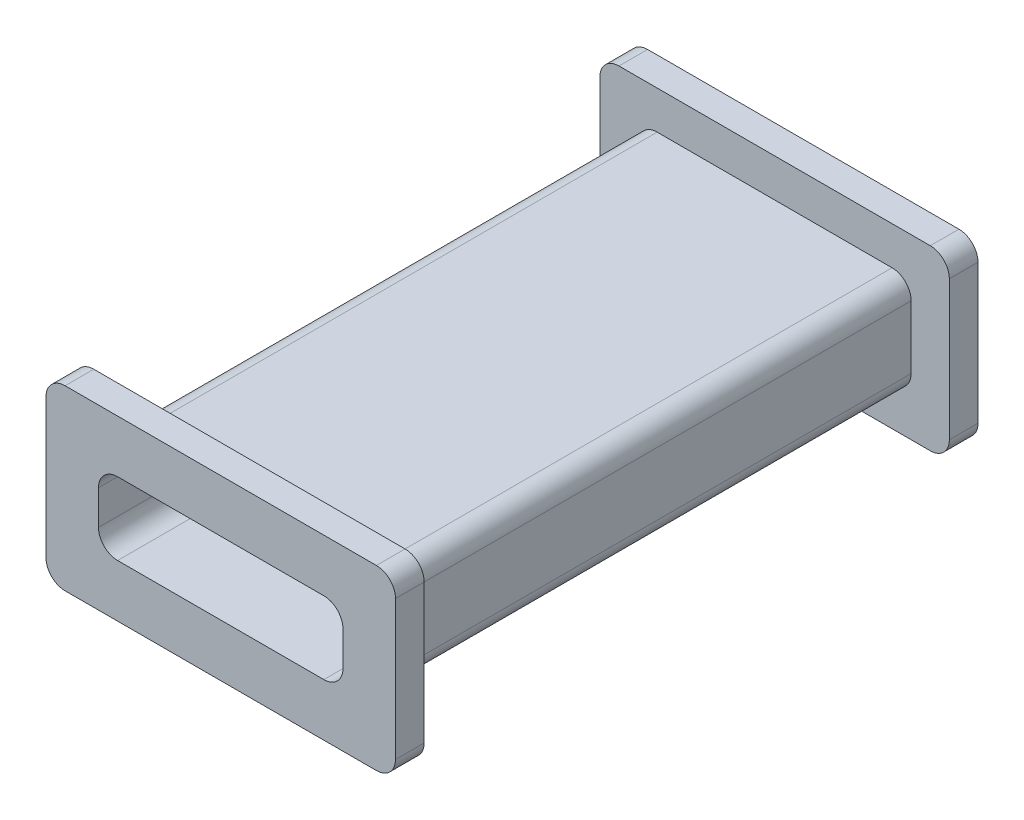
ISO-10303-21;
HEADER;
FILE_DESCRIPTION(('STEP AP214'),'2;1');
FILE_NAME('part.step','',(''),(''),'','','');
FILE_SCHEMA(('AUTOMOTIVE_DESIGN { 1 0 10303 214 1 1 1 1 }'));
ENDSEC;
DATA;
#1=APPLICATION_CONTEXT('core data for automotive mechanical design processes');
#2=APPLICATION_PROTOCOL_DEFINITION('international standard','automotive_design',2000,#1);
#3=PRODUCT_CONTEXT('',#1,'mechanical');
#4=PRODUCT('Part','Part','',(#3));
#5=PRODUCT_RELATED_PRODUCT_CATEGORY('part','',(#4));
#6=PRODUCT_DEFINITION_FORMATION('','',#4);
#7=PRODUCT_DEFINITION_CONTEXT('part definition',#1,'design');
#8=PRODUCT_DEFINITION('design','',#6,#7);
#9=PRODUCT_DEFINITION_SHAPE('','',#8);
#10=(LENGTH_UNIT() NAMED_UNIT(*) SI_UNIT(.MILLI.,.METRE.));
#11=(NAMED_UNIT(*) PLANE_ANGLE_UNIT() SI_UNIT($,.RADIAN.));
#12=(NAMED_UNIT(*) SI_UNIT($,.STERADIAN.) SOLID_ANGLE_UNIT());
#13=UNCERTAINTY_MEASURE_WITH_UNIT(LENGTH_MEASURE(1.E-05),#10,'distance_accuracy_value','');
#14=(GEOMETRIC_REPRESENTATION_CONTEXT(3) GLOBAL_UNCERTAINTY_ASSIGNED_CONTEXT((#13)) GLOBAL_UNIT_ASSIGNED_CONTEXT((#10,
#11,#12)) REPRESENTATION_CONTEXT('',''));
#15=CARTESIAN_POINT('',(0.,0.,0.));
#16=DIRECTION('',(0.,0.,1.));
#17=DIRECTION('',(1.,0.,0.));
#18=AXIS2_PLACEMENT_3D('',#15,#16,#17);
#19=CARTESIAN_POINT('',(14.3,-5.3,55.));
#20=DIRECTION('',(-1.,0.,0.));
#21=DIRECTION('',(0.,0.,1.));
#22=AXIS2_PLACEMENT_3D('',#19,#20,#21);
#23=PLANE('',#22);
#24=DIRECTION('',(0.,1.,0.));
#25=VECTOR('',#24,1.);
#26=CARTESIAN_POINT('',(14.3,-5.3,55.));
#27=LINE('',#26,#25);
#28=CARTESIAN_POINT('',(14.3,-3.3,55.));
#29=VERTEX_POINT('',#28);
#30=CARTESIAN_POINT('',(14.3,3.3,55.));
#31=VERTEX_POINT('',#30);
#32=EDGE_CURVE('E431',#29,#31,#27,.T.);
#33=ORIENTED_EDGE('',*,*,#32,.F.);
#34=DIRECTION('',(0.,0.,-1.));
#35=VECTOR('',#34,1.);
#36=CARTESIAN_POINT('',(14.3,-3.3,55.));
#37=LINE('',#36,#35);
#38=CARTESIAN_POINT('',(14.3,-3.3,0.));
#39=VERTEX_POINT('',#38);
#40=EDGE_CURVE('E254',#29,#39,#37,.T.);
#41=ORIENTED_EDGE('',*,*,#40,.T.);
#42=DIRECTION('',(0.,1.,0.));
#43=VECTOR('',#42,1.);
#44=CARTESIAN_POINT('',(14.3,-5.3,0.));
#45=LINE('',#44,#43);
#46=CARTESIAN_POINT('',(14.3,3.3,0.));
#47=VERTEX_POINT('',#46);
#48=EDGE_CURVE('E259',#39,#47,#45,.T.);
#49=ORIENTED_EDGE('',*,*,#48,.T.);
#50=DIRECTION('',(0.,0.,-1.));
#51=VECTOR('',#50,1.);
#52=CARTESIAN_POINT('',(14.3,3.3,55.));
#53=LINE('',#52,#51);
#54=EDGE_CURVE('E243',#47,#31,#53,.F.);
#55=ORIENTED_EDGE('',*,*,#54,.T.);
#56=EDGE_LOOP('',(#33,#41,#49,#55));
#57=FACE_BOUND('',#56,.T.);
#58=ADVANCED_FACE('F34',(#57),#23,.F.);
#59=CARTESIAN_POINT('',(-14.3,5.3,55.));
#60=DIRECTION('',(0.,-1.,0.));
#61=DIRECTION('',(0.,0.,-1.));
#62=AXIS2_PLACEMENT_3D('',#59,#60,#61);
#63=PLANE('',#62);
#64=DIRECTION('',(-1.,0.,0.));
#65=VECTOR('',#64,1.);
#66=CARTESIAN_POINT('',(-14.3,5.3,0.));
#67=LINE('',#66,#65);
#68=CARTESIAN_POINT('',(12.3,5.3,0.));
#69=VERTEX_POINT('',#68);
#70=CARTESIAN_POINT('',(-12.3,5.3,0.));
#71=VERTEX_POINT('',#70);
#72=EDGE_CURVE('E263',#69,#71,#67,.T.);
#73=ORIENTED_EDGE('',*,*,#72,.T.);
#74=DIRECTION('',(0.,0.,-1.));
#75=VECTOR('',#74,1.);
#76=CARTESIAN_POINT('',(-12.3,5.3,55.));
#77=LINE('',#76,#75);
#78=CARTESIAN_POINT('',(-12.3,5.3,55.));
#79=VERTEX_POINT('',#78);
#80=EDGE_CURVE('E255',#71,#79,#77,.F.);
#81=ORIENTED_EDGE('',*,*,#80,.T.);
#82=DIRECTION('',(-1.,0.,0.));
#83=VECTOR('',#82,1.);
#84=CARTESIAN_POINT('',(-14.3,5.3,55.));
#85=LINE('',#84,#83);
#86=CARTESIAN_POINT('',(12.3,5.3,55.));
#87=VERTEX_POINT('',#86);
#88=EDGE_CURVE('E433',#87,#79,#85,.T.);
#89=ORIENTED_EDGE('',*,*,#88,.F.);
#90=DIRECTION('',(0.,0.,-1.));
#91=VECTOR('',#90,1.);
#92=CARTESIAN_POINT('',(12.3,5.3,55.));
#93=LINE('',#92,#91);
#94=EDGE_CURVE('E290',#87,#69,#93,.T.);
#95=ORIENTED_EDGE('',*,*,#94,.T.);
#96=EDGE_LOOP('',(#73,#81,#89,#95));
#97=FACE_BOUND('',#96,.T.);
#98=ADVANCED_FACE('F507',(#97),#63,.F.);
#99=CARTESIAN_POINT('',(-14.3,-5.3,55.));
#100=DIRECTION('',(1.,0.,0.));
#101=DIRECTION('',(0.,0.,-1.));
#102=AXIS2_PLACEMENT_3D('',#99,#100,#101);
#103=PLANE('',#102);
#104=DIRECTION('',(0.,-1.,0.));
#105=VECTOR('',#104,1.);
#106=CARTESIAN_POINT('',(-14.3,-5.3,0.));
#107=LINE('',#106,#105);
#108=CARTESIAN_POINT('',(-14.3,3.3,0.));
#109=VERTEX_POINT('',#108);
#110=CARTESIAN_POINT('',(-14.3,-3.3,0.));
#111=VERTEX_POINT('',#110);
#112=EDGE_CURVE('E445',#109,#111,#107,.T.);
#113=ORIENTED_EDGE('',*,*,#112,.T.);
#114=DIRECTION('',(0.,0.,-1.));
#115=VECTOR('',#114,1.);
#116=CARTESIAN_POINT('',(-14.3,-3.3,55.));
#117=LINE('',#116,#115);
#118=CARTESIAN_POINT('',(-14.3,-3.3,55.));
#119=VERTEX_POINT('',#118);
#120=EDGE_CURVE('E288',#111,#119,#117,.F.);
#121=ORIENTED_EDGE('',*,*,#120,.T.);
#122=DIRECTION('',(0.,-1.,0.));
#123=VECTOR('',#122,1.);
#124=CARTESIAN_POINT('',(-14.3,-5.3,55.));
#125=LINE('',#124,#123);
#126=CARTESIAN_POINT('',(-14.3,3.3,55.));
#127=VERTEX_POINT('',#126);
#128=EDGE_CURVE('E437',#127,#119,#125,.T.);
#129=ORIENTED_EDGE('',*,*,#128,.F.);
#130=DIRECTION('',(0.,0.,-1.));
#131=VECTOR('',#130,1.);
#132=CARTESIAN_POINT('',(-14.3,3.3,55.));
#133=LINE('',#132,#131);
#134=EDGE_CURVE('E285',#127,#109,#133,.T.);
#135=ORIENTED_EDGE('',*,*,#134,.T.);
#136=EDGE_LOOP('',(#113,#121,#129,#135));
#137=FACE_BOUND('',#136,.T.);
#138=ADVANCED_FACE('F499',(#137),#103,.F.);
#139=CARTESIAN_POINT('',(-14.3,-5.3,55.));
#140=DIRECTION('',(0.,1.,0.));
#141=DIRECTION('',(0.,0.,1.));
#142=AXIS2_PLACEMENT_3D('',#139,#140,#141);
#143=PLANE('',#142);
#144=DIRECTION('',(1.,0.,0.));
#145=VECTOR('',#144,1.);
#146=CARTESIAN_POINT('',(-14.3,-5.3,55.));
#147=LINE('',#146,#145);
#148=CARTESIAN_POINT('',(-12.3,-5.3,55.));
#149=VERTEX_POINT('',#148);
#150=CARTESIAN_POINT('',(12.3,-5.3,55.));
#151=VERTEX_POINT('',#150);
#152=EDGE_CURVE('E440',#149,#151,#147,.T.);
#153=ORIENTED_EDGE('',*,*,#152,.F.);
#154=DIRECTION('',(0.,0.,-1.));
#155=VECTOR('',#154,1.);
#156=CARTESIAN_POINT('',(-12.3,-5.3,55.));
#157=LINE('',#156,#155);
#158=CARTESIAN_POINT('',(-12.3,-5.3,0.));
#159=VERTEX_POINT('',#158);
#160=EDGE_CURVE('E272',#149,#159,#157,.T.);
#161=ORIENTED_EDGE('',*,*,#160,.T.);
#162=DIRECTION('',(1.,0.,0.));
#163=VECTOR('',#162,1.);
#164=CARTESIAN_POINT('',(-14.3,-5.3,0.));
#165=LINE('',#164,#163);
#166=CARTESIAN_POINT('',(12.3,-5.3,0.));
#167=VERTEX_POINT('',#166);
#168=EDGE_CURVE('E434',#159,#167,#165,.T.);
#169=ORIENTED_EDGE('',*,*,#168,.T.);
#170=DIRECTION('',(0.,0.,-1.));
#171=VECTOR('',#170,1.);
#172=CARTESIAN_POINT('',(12.3,-5.3,55.));
#173=LINE('',#172,#171);
#174=EDGE_CURVE('E277',#167,#151,#173,.F.);
#175=ORIENTED_EDGE('',*,*,#174,.T.);
#176=EDGE_LOOP('',(#153,#161,#169,#175));
#177=FACE_BOUND('',#176,.T.);
#178=ADVANCED_FACE('F485',(#177),#143,.F.);
#179=CARTESIAN_POINT('',(12.8,-3.8,55.));
#180=DIRECTION('',(-1.,0.,0.));
#181=DIRECTION('',(0.,0.,1.));
#182=AXIS2_PLACEMENT_3D('',#179,#180,#181);
#183=PLANE('',#182);
#184=DIRECTION('',(0.,1.,0.));
#185=VECTOR('',#184,1.);
#186=CARTESIAN_POINT('',(12.8,-3.8,-3.));
#187=LINE('',#186,#185);
#188=CARTESIAN_POINT('',(12.8,-1.8,-3.));
#189=VERTEX_POINT('',#188);
#190=CARTESIAN_POINT('',(12.8,1.8,-3.));
#191=VERTEX_POINT('',#190);
#192=EDGE_CURVE('E374',#189,#191,#187,.T.);
#193=ORIENTED_EDGE('',*,*,#192,.F.);
#194=DIRECTION('',(0.,0.,-1.));
#195=VECTOR('',#194,1.);
#196=CARTESIAN_POINT('',(12.8,-1.8,58.));
#197=LINE('',#196,#195);
#198=CARTESIAN_POINT('',(12.8,-1.8,58.));
#199=VERTEX_POINT('',#198);
#200=EDGE_CURVE('E345',#189,#199,#197,.F.);
#201=ORIENTED_EDGE('',*,*,#200,.T.);
#202=DIRECTION('',(0.,1.,0.));
#203=VECTOR('',#202,1.);
#204=CARTESIAN_POINT('',(12.8,-3.8,58.));
#205=LINE('',#204,#203);
#206=CARTESIAN_POINT('',(12.8,1.8,58.));
#207=VERTEX_POINT('',#206);
#208=EDGE_CURVE('E386',#199,#207,#205,.T.);
#209=ORIENTED_EDGE('',*,*,#208,.T.);
#210=DIRECTION('',(0.,0.,-1.));
#211=VECTOR('',#210,1.);
#212=CARTESIAN_POINT('',(12.8,1.8,-3.));
#213=LINE('',#212,#211);
#214=EDGE_CURVE('E342',#207,#191,#213,.T.);
#215=ORIENTED_EDGE('',*,*,#214,.T.);
#216=EDGE_LOOP('',(#193,#201,#209,#215));
#217=FACE_BOUND('',#216,.T.);
#218=ADVANCED_FACE('F390',(#217),#183,.T.);
#219=CARTESIAN_POINT('',(-12.8,3.8,55.));
#220=DIRECTION('',(0.,-1.,0.));
#221=DIRECTION('',(0.,0.,-1.));
#222=AXIS2_PLACEMENT_3D('',#219,#220,#221);
#223=PLANE('',#222);
#224=DIRECTION('',(-1.,0.,0.));
#225=VECTOR('',#224,1.);
#226=CARTESIAN_POINT('',(-12.8,3.8,58.));
#227=LINE('',#226,#225);
#228=CARTESIAN_POINT('',(10.8,3.8,58.));
#229=VERTEX_POINT('',#228);
#230=CARTESIAN_POINT('',(-10.8,3.8,58.));
#231=VERTEX_POINT('',#230);
#232=EDGE_CURVE('E388',#229,#231,#227,.T.);
#233=ORIENTED_EDGE('',*,*,#232,.T.);
#234=DIRECTION('',(0.,0.,-1.));
#235=VECTOR('',#234,1.);
#236=CARTESIAN_POINT('',(-10.8,3.8,-3.));
#237=LINE('',#236,#235);
#238=CARTESIAN_POINT('',(-10.8,3.8,-3.));
#239=VERTEX_POINT('',#238);
#240=EDGE_CURVE('E353',#231,#239,#237,.T.);
#241=ORIENTED_EDGE('',*,*,#240,.T.);
#242=DIRECTION('',(-1.,0.,0.));
#243=VECTOR('',#242,1.);
#244=CARTESIAN_POINT('',(-12.8,3.8,-3.));
#245=LINE('',#244,#243);
#246=CARTESIAN_POINT('',(10.8,3.8,-3.));
#247=VERTEX_POINT('',#246);
#248=EDGE_CURVE('E372',#247,#239,#245,.T.);
#249=ORIENTED_EDGE('',*,*,#248,.F.);
#250=DIRECTION('',(0.,0.,-1.));
#251=VECTOR('',#250,1.);
#252=CARTESIAN_POINT('',(10.8,3.8,58.));
#253=LINE('',#252,#251);
#254=EDGE_CURVE('E56',#247,#229,#253,.F.);
#255=ORIENTED_EDGE('',*,*,#254,.T.);
#256=EDGE_LOOP('',(#233,#241,#249,#255));
#257=FACE_BOUND('',#256,.T.);
#258=ADVANCED_FACE('F377',(#257),#223,.T.);
#259=CARTESIAN_POINT('',(-12.8,-3.8,55.));
#260=DIRECTION('',(1.,0.,0.));
#261=DIRECTION('',(0.,0.,-1.));
#262=AXIS2_PLACEMENT_3D('',#259,#260,#261);
#263=PLANE('',#262);
#264=DIRECTION('',(0.,-1.,0.));
#265=VECTOR('',#264,1.);
#266=CARTESIAN_POINT('',(-12.8,-3.8,58.));
#267=LINE('',#266,#265);
#268=CARTESIAN_POINT('',(-12.8,1.8,58.));
#269=VERTEX_POINT('',#268);
#270=CARTESIAN_POINT('',(-12.8,-1.8,58.));
#271=VERTEX_POINT('',#270);
#272=EDGE_CURVE('E394',#269,#271,#267,.T.);
#273=ORIENTED_EDGE('',*,*,#272,.T.);
#274=DIRECTION('',(0.,0.,-1.));
#275=VECTOR('',#274,1.);
#276=CARTESIAN_POINT('',(-12.8,-1.8,-3.));
#277=LINE('',#276,#275);
#278=CARTESIAN_POINT('',(-12.8,-1.8,-3.));
#279=VERTEX_POINT('',#278);
#280=EDGE_CURVE('E349',#271,#279,#277,.T.);
#281=ORIENTED_EDGE('',*,*,#280,.T.);
#282=DIRECTION('',(0.,-1.,0.));
#283=VECTOR('',#282,1.);
#284=CARTESIAN_POINT('',(-12.8,-3.8,-3.));
#285=LINE('',#284,#283);
#286=CARTESIAN_POINT('',(-12.8,1.8,-3.));
#287=VERTEX_POINT('',#286);
#288=EDGE_CURVE('E380',#287,#279,#285,.T.);
#289=ORIENTED_EDGE('',*,*,#288,.F.);
#290=DIRECTION('',(0.,0.,-1.));
#291=VECTOR('',#290,1.);
#292=CARTESIAN_POINT('',(-12.8,1.8,58.));
#293=LINE('',#292,#291);
#294=EDGE_CURVE('E347',#287,#269,#293,.F.);
#295=ORIENTED_EDGE('',*,*,#294,.T.);
#296=EDGE_LOOP('',(#273,#281,#289,#295));
#297=FACE_BOUND('',#296,.T.);
#298=ADVANCED_FACE('F576',(#297),#263,.T.);
#299=CARTESIAN_POINT('',(-12.8,-3.8,55.));
#300=DIRECTION('',(0.,1.,0.));
#301=DIRECTION('',(0.,0.,1.));
#302=AXIS2_PLACEMENT_3D('',#299,#300,#301);
#303=PLANE('',#302);
#304=DIRECTION('',(1.,0.,0.));
#305=VECTOR('',#304,1.);
#306=CARTESIAN_POINT('',(-12.8,-3.8,58.));
#307=LINE('',#306,#305);
#308=CARTESIAN_POINT('',(-10.8,-3.8,58.));
#309=VERTEX_POINT('',#308);
#310=CARTESIAN_POINT('',(10.8,-3.8,58.));
#311=VERTEX_POINT('',#310);
#312=EDGE_CURVE('E405',#309,#311,#307,.T.);
#313=ORIENTED_EDGE('',*,*,#312,.T.);
#314=DIRECTION('',(0.,0.,-1.));
#315=VECTOR('',#314,1.);
#316=CARTESIAN_POINT('',(10.8,-3.8,-3.));
#317=LINE('',#316,#315);
#318=CARTESIAN_POINT('',(10.8,-3.8,-3.));
#319=VERTEX_POINT('',#318);
#320=EDGE_CURVE('E339',#311,#319,#317,.T.);
#321=ORIENTED_EDGE('',*,*,#320,.T.);
#322=DIRECTION('',(1.,0.,0.));
#323=VECTOR('',#322,1.);
#324=CARTESIAN_POINT('',(-12.8,-3.8,-3.));
#325=LINE('',#324,#323);
#326=CARTESIAN_POINT('',(-10.8,-3.8,-3.));
#327=VERTEX_POINT('',#326);
#328=EDGE_CURVE('E578',#327,#319,#325,.T.);
#329=ORIENTED_EDGE('',*,*,#328,.F.);
#330=DIRECTION('',(0.,0.,-1.));
#331=VECTOR('',#330,1.);
#332=CARTESIAN_POINT('',(-10.8,-3.8,58.));
#333=LINE('',#332,#331);
#334=EDGE_CURVE('E337',#327,#309,#333,.F.);
#335=ORIENTED_EDGE('',*,*,#334,.T.);
#336=EDGE_LOOP('',(#313,#321,#329,#335));
#337=FACE_BOUND('',#336,.T.);
#338=ADVANCED_FACE('F644',(#337),#303,.T.);
#339=CARTESIAN_POINT('',(0.,0.,55.));
#340=DIRECTION('',(0.,0.,-1.));
#341=DIRECTION('',(-1.,0.,0.));
#342=AXIS2_PLACEMENT_3D('',#339,#340,#341);
#343=PLANE('',#342);
#344=DIRECTION('',(1.,0.,0.));
#345=VECTOR('',#344,1.);
#346=CARTESIAN_POINT('',(-18.3,-9.3,55.));
#347=LINE('',#346,#345);
#348=CARTESIAN_POINT('',(-16.3,-9.3,55.));
#349=VERTEX_POINT('',#348);
#350=CARTESIAN_POINT('',(16.3,-9.3,55.));
#351=VERTEX_POINT('',#350);
#352=EDGE_CURVE('E413',#349,#351,#347,.T.);
#353=ORIENTED_EDGE('',*,*,#352,.F.);
#354=CARTESIAN_POINT('',(-16.3,-7.3,55.));
#355=DIRECTION('',(0.,0.,-1.));
#356=DIRECTION('',(-1.,0.,0.));
#357=AXIS2_PLACEMENT_3D('',#354,#355,#356);
#358=CIRCLE('',#357,2.);
#359=CARTESIAN_POINT('',(-18.3,-7.3,55.));
#360=VERTEX_POINT('',#359);
#361=EDGE_CURVE('E458',#349,#360,#358,.T.);
#362=ORIENTED_EDGE('',*,*,#361,.T.);
#363=DIRECTION('',(0.,-1.,0.));
#364=VECTOR('',#363,1.);
#365=CARTESIAN_POINT('',(-18.3,-9.3,55.));
#366=LINE('',#365,#364);
#367=CARTESIAN_POINT('',(-18.3,7.3,55.));
#368=VERTEX_POINT('',#367);
#369=EDGE_CURVE('E426',#368,#360,#366,.T.);
#370=ORIENTED_EDGE('',*,*,#369,.F.);
#371=CARTESIAN_POINT('',(-16.3,7.3,55.));
#372=DIRECTION('',(0.,0.,-1.));
#373=DIRECTION('',(-1.,0.,0.));
#374=AXIS2_PLACEMENT_3D('',#371,#372,#373);
#375=CIRCLE('',#374,2.);
#376=CARTESIAN_POINT('',(-16.3,9.3,55.));
#377=VERTEX_POINT('',#376);
#378=EDGE_CURVE('E454',#368,#377,#375,.T.);
#379=ORIENTED_EDGE('',*,*,#378,.T.);
#380=DIRECTION('',(-1.,0.,0.));
#381=VECTOR('',#380,1.);
#382=CARTESIAN_POINT('',(-18.3,9.3,55.));
#383=LINE('',#382,#381);
#384=CARTESIAN_POINT('',(16.3,9.3,55.));
#385=VERTEX_POINT('',#384);
#386=EDGE_CURVE('E423',#385,#377,#383,.T.);
#387=ORIENTED_EDGE('',*,*,#386,.F.);
#388=CARTESIAN_POINT('',(16.3,7.3,55.));
#389=DIRECTION('',(0.,0.,-1.));
#390=DIRECTION('',(-1.,0.,0.));
#391=AXIS2_PLACEMENT_3D('',#388,#389,#390);
#392=CIRCLE('',#391,2.);
#393=CARTESIAN_POINT('',(18.3,7.3,55.));
#394=VERTEX_POINT('',#393);
#395=EDGE_CURVE('E452',#385,#394,#392,.T.);
#396=ORIENTED_EDGE('',*,*,#395,.T.);
#397=DIRECTION('',(0.,1.,0.));
#398=VECTOR('',#397,1.);
#399=CARTESIAN_POINT('',(18.3,-9.3,55.));
#400=LINE('',#399,#398);
#401=CARTESIAN_POINT('',(18.3,-7.3,55.));
#402=VERTEX_POINT('',#401);
#403=EDGE_CURVE('E408',#402,#394,#400,.T.);
#404=ORIENTED_EDGE('',*,*,#403,.F.);
#405=CARTESIAN_POINT('',(16.3,-7.3,55.));
#406=DIRECTION('',(0.,0.,-1.));
#407=DIRECTION('',(-1.,0.,0.));
#408=AXIS2_PLACEMENT_3D('',#405,#406,#407);
#409=CIRCLE('',#408,2.);
#410=EDGE_CURVE('E456',#402,#351,#409,.T.);
#411=ORIENTED_EDGE('',*,*,#410,.T.);
#412=EDGE_LOOP('',(#353,#362,#370,#379,#387,#396,#404,#411));
#413=FACE_BOUND('',#412,.T.);
#414=ORIENTED_EDGE('',*,*,#152,.T.);
#415=CARTESIAN_POINT('',(12.3,-3.3,55.));
#416=DIRECTION('',(0.,0.,-1.));
#417=DIRECTION('',(-1.,0.,0.));
#418=AXIS2_PLACEMENT_3D('',#415,#416,#417);
#419=CIRCLE('',#418,2.);
#420=EDGE_CURVE('E298',#151,#29,#419,.F.);
#421=ORIENTED_EDGE('',*,*,#420,.T.);
#422=ORIENTED_EDGE('',*,*,#32,.T.);
#423=CARTESIAN_POINT('',(12.3,3.3,55.));
#424=DIRECTION('',(0.,0.,-1.));
#425=DIRECTION('',(-1.,0.,0.));
#426=AXIS2_PLACEMENT_3D('',#423,#424,#425);
#427=CIRCLE('',#426,2.);
#428=EDGE_CURVE('E250',#31,#87,#427,.F.);
#429=ORIENTED_EDGE('',*,*,#428,.T.);
#430=ORIENTED_EDGE('',*,*,#88,.T.);
#431=CARTESIAN_POINT('',(-12.3,3.3,55.));
#432=DIRECTION('',(0.,0.,-1.));
#433=DIRECTION('',(-1.,0.,0.));
#434=AXIS2_PLACEMENT_3D('',#431,#432,#433);
#435=CIRCLE('',#434,2.);
#436=EDGE_CURVE('E296',#79,#127,#435,.F.);
#437=ORIENTED_EDGE('',*,*,#436,.T.);
#438=ORIENTED_EDGE('',*,*,#128,.T.);
#439=CARTESIAN_POINT('',(-12.3,-3.3,55.));
#440=DIRECTION('',(0.,0.,-1.));
#441=DIRECTION('',(-1.,0.,0.));
#442=AXIS2_PLACEMENT_3D('',#439,#440,#441);
#443=CIRCLE('',#442,2.);
#444=EDGE_CURVE('E294',#119,#149,#443,.F.);
#445=ORIENTED_EDGE('',*,*,#444,.T.);
#446=EDGE_LOOP('',(#414,#421,#422,#429,#430,#437,#438,#445));
#447=FACE_BOUND('',#446,.T.);
#448=ADVANCED_FACE('F490',(#413,#447),#343,.T.);
#449=CARTESIAN_POINT('',(0.,0.,58.));
#450=DIRECTION('',(0.,0.,-1.));
#451=DIRECTION('',(-1.,0.,0.));
#452=AXIS2_PLACEMENT_3D('',#449,#450,#451);
#453=PLANE('',#452);
#454=DIRECTION('',(0.,-1.,0.));
#455=VECTOR('',#454,1.);
#456=CARTESIAN_POINT('',(-18.3,-9.3,58.));
#457=LINE('',#456,#455);
#458=CARTESIAN_POINT('',(-18.3,7.3,58.));
#459=VERTEX_POINT('',#458);
#460=CARTESIAN_POINT('',(-18.3,-7.3,58.));
#461=VERTEX_POINT('',#460);
#462=EDGE_CURVE('E416',#459,#461,#457,.T.);
#463=ORIENTED_EDGE('',*,*,#462,.T.);
#464=CARTESIAN_POINT('',(-16.3,-7.3,58.));
#465=DIRECTION('',(0.,0.,-1.));
#466=DIRECTION('',(-1.,0.,0.));
#467=AXIS2_PLACEMENT_3D('',#464,#465,#466);
#468=CIRCLE('',#467,2.);
#469=CARTESIAN_POINT('',(-16.3,-9.3,58.));
#470=VERTEX_POINT('',#469);
#471=EDGE_CURVE('E471',#461,#470,#468,.F.);
#472=ORIENTED_EDGE('',*,*,#471,.T.);
#473=DIRECTION('',(1.,0.,0.));
#474=VECTOR('',#473,1.);
#475=CARTESIAN_POINT('',(-18.3,-9.3,58.));
#476=LINE('',#475,#474);
#477=CARTESIAN_POINT('',(16.3,-9.3,58.));
#478=VERTEX_POINT('',#477);
#479=EDGE_CURVE('E264',#470,#478,#476,.T.);
#480=ORIENTED_EDGE('',*,*,#479,.T.);
#481=CARTESIAN_POINT('',(16.3,-7.3,58.));
#482=DIRECTION('',(0.,0.,-1.));
#483=DIRECTION('',(-1.,0.,0.));
#484=AXIS2_PLACEMENT_3D('',#481,#482,#483);
#485=CIRCLE('',#484,2.);
#486=CARTESIAN_POINT('',(18.3,-7.3,58.));
#487=VERTEX_POINT('',#486);
#488=EDGE_CURVE('E469',#478,#487,#485,.F.);
#489=ORIENTED_EDGE('',*,*,#488,.T.);
#490=DIRECTION('',(0.,1.,0.));
#491=VECTOR('',#490,1.);
#492=CARTESIAN_POINT('',(18.3,-9.3,58.));
#493=LINE('',#492,#491);
#494=CARTESIAN_POINT('',(18.3,7.3,58.));
#495=VERTEX_POINT('',#494);
#496=EDGE_CURVE('E409',#487,#495,#493,.T.);
#497=ORIENTED_EDGE('',*,*,#496,.T.);
#498=CARTESIAN_POINT('',(16.3,7.3,58.));
#499=DIRECTION('',(0.,0.,-1.));
#500=DIRECTION('',(-1.,0.,0.));
#501=AXIS2_PLACEMENT_3D('',#498,#499,#500);
#502=CIRCLE('',#501,2.);
#503=CARTESIAN_POINT('',(16.3,9.3,58.));
#504=VERTEX_POINT('',#503);
#505=EDGE_CURVE('E465',#495,#504,#502,.F.);
#506=ORIENTED_EDGE('',*,*,#505,.T.);
#507=DIRECTION('',(-1.,0.,0.));
#508=VECTOR('',#507,1.);
#509=CARTESIAN_POINT('',(-18.3,9.3,58.));
#510=LINE('',#509,#508);
#511=CARTESIAN_POINT('',(-16.3,9.3,58.));
#512=VERTEX_POINT('',#511);
#513=EDGE_CURVE('E412',#504,#512,#510,.T.);
#514=ORIENTED_EDGE('',*,*,#513,.T.);
#515=CARTESIAN_POINT('',(-16.3,7.3,58.));
#516=DIRECTION('',(0.,0.,-1.));
#517=DIRECTION('',(-1.,0.,0.));
#518=AXIS2_PLACEMENT_3D('',#515,#516,#517);
#519=CIRCLE('',#518,2.);
#520=EDGE_CURVE('E467',#512,#459,#519,.F.);
#521=ORIENTED_EDGE('',*,*,#520,.T.);
#522=EDGE_LOOP('',(#463,#472,#480,#489,#497,#506,#514,#521));
#523=FACE_BOUND('',#522,.T.);
#524=ORIENTED_EDGE('',*,*,#208,.F.);
#525=CARTESIAN_POINT('',(10.8,-1.8,58.));
#526=DIRECTION('',(0.,0.,-1.));
#527=DIRECTION('',(-1.,0.,0.));
#528=AXIS2_PLACEMENT_3D('',#525,#526,#527);
#529=CIRCLE('',#528,2.);
#530=EDGE_CURVE('E358',#199,#311,#529,.T.);
#531=ORIENTED_EDGE('',*,*,#530,.T.);
#532=ORIENTED_EDGE('',*,*,#312,.F.);
#533=CARTESIAN_POINT('',(-10.8,-1.8,58.));
#534=DIRECTION('',(0.,0.,-1.));
#535=DIRECTION('',(-1.,0.,0.));
#536=AXIS2_PLACEMENT_3D('',#533,#534,#535);
#537=CIRCLE('',#536,2.);
#538=EDGE_CURVE('E362',#309,#271,#537,.T.);
#539=ORIENTED_EDGE('',*,*,#538,.T.);
#540=ORIENTED_EDGE('',*,*,#272,.F.);
#541=CARTESIAN_POINT('',(-10.8,1.8,58.));
#542=DIRECTION('',(0.,0.,-1.));
#543=DIRECTION('',(-1.,0.,0.));
#544=AXIS2_PLACEMENT_3D('',#541,#542,#543);
#545=CIRCLE('',#544,2.);
#546=EDGE_CURVE('E49',#269,#231,#545,.T.);
#547=ORIENTED_EDGE('',*,*,#546,.T.);
#548=ORIENTED_EDGE('',*,*,#232,.F.);
#549=CARTESIAN_POINT('',(10.8,1.8,58.));
#550=DIRECTION('',(0.,0.,-1.));
#551=DIRECTION('',(-1.,0.,0.));
#552=AXIS2_PLACEMENT_3D('',#549,#550,#551);
#553=CIRCLE('',#552,2.);
#554=EDGE_CURVE('E11',#229,#207,#553,.T.);
#555=ORIENTED_EDGE('',*,*,#554,.T.);
#556=EDGE_LOOP('',(#524,#531,#532,#539,#540,#547,#548,#555));
#557=FACE_BOUND('',#556,.T.);
#558=ADVANCED_FACE('F385',(#523,#557),#453,.F.);
#559=CARTESIAN_POINT('',(18.3,-9.3,58.));
#560=DIRECTION('',(-1.,0.,0.));
#561=DIRECTION('',(0.,0.,1.));
#562=AXIS2_PLACEMENT_3D('',#559,#560,#561);
#563=PLANE('',#562);
#564=ORIENTED_EDGE('',*,*,#496,.F.);
#565=DIRECTION('',(0.,0.,-1.));
#566=VECTOR('',#565,1.);
#567=CARTESIAN_POINT('',(18.3,-7.3,58.));
#568=LINE('',#567,#566);
#569=EDGE_CURVE('E475',#487,#402,#568,.T.);
#570=ORIENTED_EDGE('',*,*,#569,.T.);
#571=ORIENTED_EDGE('',*,*,#403,.T.);
#572=DIRECTION('',(0.,0.,-1.));
#573=VECTOR('',#572,1.);
#574=CARTESIAN_POINT('',(18.3,7.3,58.));
#575=LINE('',#574,#573);
#576=EDGE_CURVE('E473',#394,#495,#575,.F.);
#577=ORIENTED_EDGE('',*,*,#576,.T.);
#578=EDGE_LOOP('',(#564,#570,#571,#577));
#579=FACE_BOUND('',#578,.T.);
#580=ADVANCED_FACE('F640',(#579),#563,.F.);
#581=CARTESIAN_POINT('',(-18.3,9.3,58.));
#582=DIRECTION('',(0.,-1.,0.));
#583=DIRECTION('',(0.,0.,-1.));
#584=AXIS2_PLACEMENT_3D('',#581,#582,#583);
#585=PLANE('',#584);
#586=ORIENTED_EDGE('',*,*,#386,.T.);
#587=DIRECTION('',(0.,0.,-1.));
#588=VECTOR('',#587,1.);
#589=CARTESIAN_POINT('',(-16.3,9.3,58.));
#590=LINE('',#589,#588);
#591=EDGE_CURVE('E481',#377,#512,#590,.F.);
#592=ORIENTED_EDGE('',*,*,#591,.T.);
#593=ORIENTED_EDGE('',*,*,#513,.F.);
#594=DIRECTION('',(0.,0.,-1.));
#595=VECTOR('',#594,1.);
#596=CARTESIAN_POINT('',(16.3,9.3,58.));
#597=LINE('',#596,#595);
#598=EDGE_CURVE('E478',#504,#385,#597,.T.);
#599=ORIENTED_EDGE('',*,*,#598,.T.);
#600=EDGE_LOOP('',(#586,#592,#593,#599));
#601=FACE_BOUND('',#600,.T.);
#602=ADVANCED_FACE('F652',(#601),#585,.F.);
#603=CARTESIAN_POINT('',(-18.3,-9.3,58.));
#604=DIRECTION('',(1.,0.,0.));
#605=DIRECTION('',(0.,0.,-1.));
#606=AXIS2_PLACEMENT_3D('',#603,#604,#605);
#607=PLANE('',#606);
#608=ORIENTED_EDGE('',*,*,#369,.T.);
#609=DIRECTION('',(0.,0.,-1.));
#610=VECTOR('',#609,1.);
#611=CARTESIAN_POINT('',(-18.3,-7.3,58.));
#612=LINE('',#611,#610);
#613=EDGE_CURVE('E463',#360,#461,#612,.F.);
#614=ORIENTED_EDGE('',*,*,#613,.T.);
#615=ORIENTED_EDGE('',*,*,#462,.F.);
#616=DIRECTION('',(0.,0.,-1.));
#617=VECTOR('',#616,1.);
#618=CARTESIAN_POINT('',(-18.3,7.3,58.));
#619=LINE('',#618,#617);
#620=EDGE_CURVE('E460',#459,#368,#619,.T.);
#621=ORIENTED_EDGE('',*,*,#620,.T.);
#622=EDGE_LOOP('',(#608,#614,#615,#621));
#623=FACE_BOUND('',#622,.T.);
#624=ADVANCED_FACE('F648',(#623),#607,.F.);
#625=CARTESIAN_POINT('',(-18.3,-9.3,58.));
#626=DIRECTION('',(0.,1.,0.));
#627=DIRECTION('',(0.,0.,1.));
#628=AXIS2_PLACEMENT_3D('',#625,#626,#627);
#629=PLANE('',#628);
#630=ORIENTED_EDGE('',*,*,#479,.F.);
#631=DIRECTION('',(0.,0.,-1.));
#632=VECTOR('',#631,1.);
#633=CARTESIAN_POINT('',(-16.3,-9.3,58.));
#634=LINE('',#633,#632);
#635=EDGE_CURVE('E449',#470,#349,#634,.T.);
#636=ORIENTED_EDGE('',*,*,#635,.T.);
#637=ORIENTED_EDGE('',*,*,#352,.T.);
#638=DIRECTION('',(0.,0.,-1.));
#639=VECTOR('',#638,1.);
#640=CARTESIAN_POINT('',(16.3,-9.3,58.));
#641=LINE('',#640,#639);
#642=EDGE_CURVE('E442',#351,#478,#641,.F.);
#643=ORIENTED_EDGE('',*,*,#642,.T.);
#644=EDGE_LOOP('',(#630,#636,#637,#643));
#645=FACE_BOUND('',#644,.T.);
#646=ADVANCED_FACE('F522',(#645),#629,.F.);
#647=CARTESIAN_POINT('',(-16.3,-7.3,58.));
#648=DIRECTION('',(0.,0.,-1.));
#649=DIRECTION('',(-1.,0.,0.));
#650=AXIS2_PLACEMENT_3D('',#647,#648,#649);
#651=CYLINDRICAL_SURFACE('',#650,2.);
#652=ORIENTED_EDGE('',*,*,#471,.F.);
#653=ORIENTED_EDGE('',*,*,#613,.F.);
#654=ORIENTED_EDGE('',*,*,#361,.F.);
#655=ORIENTED_EDGE('',*,*,#635,.F.);
#656=EDGE_LOOP('',(#652,#653,#654,#655));
#657=FACE_BOUND('',#656,.T.);
#658=ADVANCED_FACE('F518',(#657),#651,.T.);
#659=CARTESIAN_POINT('',(16.3,-7.3,58.));
#660=DIRECTION('',(0.,0.,-1.));
#661=DIRECTION('',(-1.,0.,0.));
#662=AXIS2_PLACEMENT_3D('',#659,#660,#661);
#663=CYLINDRICAL_SURFACE('',#662,2.);
#664=ORIENTED_EDGE('',*,*,#488,.F.);
#665=ORIENTED_EDGE('',*,*,#642,.F.);
#666=ORIENTED_EDGE('',*,*,#410,.F.);
#667=ORIENTED_EDGE('',*,*,#569,.F.);
#668=EDGE_LOOP('',(#664,#665,#666,#667));
#669=FACE_BOUND('',#668,.T.);
#670=ADVANCED_FACE('F521',(#669),#663,.T.);
#671=CARTESIAN_POINT('',(-16.3,7.3,58.));
#672=DIRECTION('',(0.,0.,-1.));
#673=DIRECTION('',(-1.,0.,0.));
#674=AXIS2_PLACEMENT_3D('',#671,#672,#673);
#675=CYLINDRICAL_SURFACE('',#674,2.);
#676=ORIENTED_EDGE('',*,*,#520,.F.);
#677=ORIENTED_EDGE('',*,*,#591,.F.);
#678=ORIENTED_EDGE('',*,*,#378,.F.);
#679=ORIENTED_EDGE('',*,*,#620,.F.);
#680=EDGE_LOOP('',(#676,#677,#678,#679));
#681=FACE_BOUND('',#680,.T.);
#682=ADVANCED_FACE('F526',(#681),#675,.T.);
#683=CARTESIAN_POINT('',(16.3,7.3,58.));
#684=DIRECTION('',(0.,0.,-1.));
#685=DIRECTION('',(-1.,0.,0.));
#686=AXIS2_PLACEMENT_3D('',#683,#684,#685);
#687=CYLINDRICAL_SURFACE('',#686,2.);
#688=ORIENTED_EDGE('',*,*,#505,.F.);
#689=ORIENTED_EDGE('',*,*,#576,.F.);
#690=ORIENTED_EDGE('',*,*,#395,.F.);
#691=ORIENTED_EDGE('',*,*,#598,.F.);
#692=EDGE_LOOP('',(#688,#689,#690,#691));
#693=FACE_BOUND('',#692,.T.);
#694=ADVANCED_FACE('F530',(#693),#687,.T.);
#695=CARTESIAN_POINT('',(-12.3,-3.3,55.));
#696=DIRECTION('',(0.,0.,-1.));
#697=DIRECTION('',(-1.,0.,0.));
#698=AXIS2_PLACEMENT_3D('',#695,#696,#697);
#699=CYLINDRICAL_SURFACE('',#698,2.);
#700=ORIENTED_EDGE('',*,*,#444,.F.);
#701=ORIENTED_EDGE('',*,*,#120,.F.);
#702=CARTESIAN_POINT('',(-12.3,-3.3,0.));
#703=DIRECTION('',(0.,0.,-1.));
#704=DIRECTION('',(-1.,0.,0.));
#705=AXIS2_PLACEMENT_3D('',#702,#703,#704);
#706=CIRCLE('',#705,2.);
#707=EDGE_CURVE('E282',#159,#111,#706,.T.);
#708=ORIENTED_EDGE('',*,*,#707,.F.);
#709=ORIENTED_EDGE('',*,*,#160,.F.);
#710=EDGE_LOOP('',(#700,#701,#708,#709));
#711=FACE_BOUND('',#710,.T.);
#712=ADVANCED_FACE('F496',(#711),#699,.T.);
#713=CARTESIAN_POINT('',(-12.3,3.3,55.));
#714=DIRECTION('',(0.,0.,-1.));
#715=DIRECTION('',(-1.,0.,0.));
#716=AXIS2_PLACEMENT_3D('',#713,#714,#715);
#717=CYLINDRICAL_SURFACE('',#716,2.);
#718=ORIENTED_EDGE('',*,*,#436,.F.);
#719=ORIENTED_EDGE('',*,*,#80,.F.);
#720=CARTESIAN_POINT('',(-12.3,3.3,0.));
#721=DIRECTION('',(0.,0.,-1.));
#722=DIRECTION('',(-1.,0.,0.));
#723=AXIS2_PLACEMENT_3D('',#720,#721,#722);
#724=CIRCLE('',#723,2.);
#725=EDGE_CURVE('E274',#109,#71,#724,.T.);
#726=ORIENTED_EDGE('',*,*,#725,.F.);
#727=ORIENTED_EDGE('',*,*,#134,.F.);
#728=EDGE_LOOP('',(#718,#719,#726,#727));
#729=FACE_BOUND('',#728,.T.);
#730=ADVANCED_FACE('F505',(#729),#717,.T.);
#731=CARTESIAN_POINT('',(12.3,-3.3,55.));
#732=DIRECTION('',(0.,0.,-1.));
#733=DIRECTION('',(-1.,0.,0.));
#734=AXIS2_PLACEMENT_3D('',#731,#732,#733);
#735=CYLINDRICAL_SURFACE('',#734,2.);
#736=ORIENTED_EDGE('',*,*,#420,.F.);
#737=ORIENTED_EDGE('',*,*,#174,.F.);
#738=CARTESIAN_POINT('',(12.3,-3.3,0.));
#739=DIRECTION('',(0.,0.,-1.));
#740=DIRECTION('',(-1.,0.,0.));
#741=AXIS2_PLACEMENT_3D('',#738,#739,#740);
#742=CIRCLE('',#741,2.);
#743=EDGE_CURVE('E271',#39,#167,#742,.T.);
#744=ORIENTED_EDGE('',*,*,#743,.F.);
#745=ORIENTED_EDGE('',*,*,#40,.F.);
#746=EDGE_LOOP('',(#736,#737,#744,#745));
#747=FACE_BOUND('',#746,.T.);
#748=ADVANCED_FACE('F492',(#747),#735,.T.);
#749=CARTESIAN_POINT('',(12.3,3.3,55.));
#750=DIRECTION('',(0.,0.,-1.));
#751=DIRECTION('',(-1.,0.,0.));
#752=AXIS2_PLACEMENT_3D('',#749,#750,#751);
#753=CYLINDRICAL_SURFACE('',#752,2.);
#754=ORIENTED_EDGE('',*,*,#428,.F.);
#755=ORIENTED_EDGE('',*,*,#54,.F.);
#756=CARTESIAN_POINT('',(12.3,3.3,0.));
#757=DIRECTION('',(0.,0.,-1.));
#758=DIRECTION('',(-1.,0.,0.));
#759=AXIS2_PLACEMENT_3D('',#756,#757,#758);
#760=CIRCLE('',#759,2.);
#761=EDGE_CURVE('E248',#69,#47,#760,.T.);
#762=ORIENTED_EDGE('',*,*,#761,.F.);
#763=ORIENTED_EDGE('',*,*,#94,.F.);
#764=EDGE_LOOP('',(#754,#755,#762,#763));
#765=FACE_BOUND('',#764,.T.);
#766=ADVANCED_FACE('F245',(#765),#753,.T.);
#767=CARTESIAN_POINT('',(18.3,-9.3,-3.));
#768=DIRECTION('',(1.,0.,0.));
#769=DIRECTION('',(0.,0.,-1.));
#770=AXIS2_PLACEMENT_3D('',#767,#768,#769);
#771=PLANE('',#770);
#772=DIRECTION('',(0.,1.,0.));
#773=VECTOR('',#772,1.);
#774=CARTESIAN_POINT('',(18.3,-9.3,0.));
#775=LINE('',#774,#773);
#776=CARTESIAN_POINT('',(18.3,-7.3,0.));
#777=VERTEX_POINT('',#776);
#778=CARTESIAN_POINT('',(18.3,7.3,0.));
#779=VERTEX_POINT('',#778);
#780=EDGE_CURVE('E379',#777,#779,#775,.T.);
#781=ORIENTED_EDGE('',*,*,#780,.F.);
#782=DIRECTION('',(0.,0.,1.));
#783=VECTOR('',#782,1.);
#784=CARTESIAN_POINT('',(18.3,-7.3,-3.));
#785=LINE('',#784,#783);
#786=CARTESIAN_POINT('',(18.3,-7.3,-3.));
#787=VERTEX_POINT('',#786);
#788=EDGE_CURVE('E330',#777,#787,#785,.F.);
#789=ORIENTED_EDGE('',*,*,#788,.T.);
#790=DIRECTION('',(0.,1.,0.));
#791=VECTOR('',#790,1.);
#792=CARTESIAN_POINT('',(18.3,-9.3,-3.));
#793=LINE('',#792,#791);
#794=CARTESIAN_POINT('',(18.3,7.3,-3.));
#795=VERTEX_POINT('',#794);
#796=EDGE_CURVE('E584',#787,#795,#793,.T.);
#797=ORIENTED_EDGE('',*,*,#796,.T.);
#798=DIRECTION('',(0.,0.,1.));
#799=VECTOR('',#798,1.);
#800=CARTESIAN_POINT('',(18.3,7.3,-3.));
#801=LINE('',#800,#799);
#802=EDGE_CURVE('E327',#795,#779,#801,.T.);
#803=ORIENTED_EDGE('',*,*,#802,.T.);
#804=EDGE_LOOP('',(#781,#789,#797,#803));
#805=FACE_BOUND('',#804,.T.);
#806=ADVANCED_FACE('F543',(#805),#771,.T.);
#807=CARTESIAN_POINT('',(-18.3,-9.3,-3.));
#808=DIRECTION('',(0.,-1.,0.));
#809=DIRECTION('',(0.,0.,-1.));
#810=AXIS2_PLACEMENT_3D('',#807,#808,#809);
#811=PLANE('',#810);
#812=DIRECTION('',(1.,0.,0.));
#813=VECTOR('',#812,1.);
#814=CARTESIAN_POINT('',(-18.3,-9.3,0.));
#815=LINE('',#814,#813);
#816=CARTESIAN_POINT('',(-16.3,-9.3,0.));
#817=VERTEX_POINT('',#816);
#818=CARTESIAN_POINT('',(16.3,-9.3,0.));
#819=VERTEX_POINT('',#818);
#820=EDGE_CURVE('E594',#817,#819,#815,.T.);
#821=ORIENTED_EDGE('',*,*,#820,.F.);
#822=DIRECTION('',(0.,0.,1.));
#823=VECTOR('',#822,1.);
#824=CARTESIAN_POINT('',(-16.3,-9.3,-3.));
#825=LINE('',#824,#823);
#826=CARTESIAN_POINT('',(-16.3,-9.3,-3.));
#827=VERTEX_POINT('',#826);
#828=EDGE_CURVE('E317',#817,#827,#825,.F.);
#829=ORIENTED_EDGE('',*,*,#828,.T.);
#830=DIRECTION('',(1.,0.,0.));
#831=VECTOR('',#830,1.);
#832=CARTESIAN_POINT('',(-18.3,-9.3,-3.));
#833=LINE('',#832,#831);
#834=CARTESIAN_POINT('',(16.3,-9.3,-3.));
#835=VERTEX_POINT('',#834);
#836=EDGE_CURVE('E587',#827,#835,#833,.T.);
#837=ORIENTED_EDGE('',*,*,#836,.T.);
#838=DIRECTION('',(0.,0.,1.));
#839=VECTOR('',#838,1.);
#840=CARTESIAN_POINT('',(16.3,-9.3,-3.));
#841=LINE('',#840,#839);
#842=EDGE_CURVE('E314',#835,#819,#841,.T.);
#843=ORIENTED_EDGE('',*,*,#842,.T.);
#844=EDGE_LOOP('',(#821,#829,#837,#843));
#845=FACE_BOUND('',#844,.T.);
#846=ADVANCED_FACE('F618',(#845),#811,.T.);
#847=CARTESIAN_POINT('',(-18.3,-9.3,-3.));
#848=DIRECTION('',(-1.,0.,0.));
#849=DIRECTION('',(0.,0.,1.));
#850=AXIS2_PLACEMENT_3D('',#847,#848,#849);
#851=PLANE('',#850);
#852=DIRECTION('',(0.,-1.,0.));
#853=VECTOR('',#852,1.);
#854=CARTESIAN_POINT('',(-18.3,-9.3,-3.));
#855=LINE('',#854,#853);
#856=CARTESIAN_POINT('',(-18.3,7.3,-3.));
#857=VERTEX_POINT('',#856);
#858=CARTESIAN_POINT('',(-18.3,-7.3,-3.));
#859=VERTEX_POINT('',#858);
#860=EDGE_CURVE('E397',#857,#859,#855,.T.);
#861=ORIENTED_EDGE('',*,*,#860,.T.);
#862=DIRECTION('',(0.,0.,1.));
#863=VECTOR('',#862,1.);
#864=CARTESIAN_POINT('',(-18.3,-7.3,-3.));
#865=LINE('',#864,#863);
#866=CARTESIAN_POINT('',(-18.3,-7.3,0.));
#867=VERTEX_POINT('',#866);
#868=EDGE_CURVE('E303',#859,#867,#865,.T.);
#869=ORIENTED_EDGE('',*,*,#868,.T.);
#870=DIRECTION('',(0.,-1.,0.));
#871=VECTOR('',#870,1.);
#872=CARTESIAN_POINT('',(-18.3,-9.3,0.));
#873=LINE('',#872,#871);
#874=CARTESIAN_POINT('',(-18.3,7.3,0.));
#875=VERTEX_POINT('',#874);
#876=EDGE_CURVE('E596',#875,#867,#873,.T.);
#877=ORIENTED_EDGE('',*,*,#876,.F.);
#878=DIRECTION('',(0.,0.,1.));
#879=VECTOR('',#878,1.);
#880=CARTESIAN_POINT('',(-18.3,7.3,-3.));
#881=LINE('',#880,#879);
#882=EDGE_CURVE('E301',#875,#857,#881,.F.);
#883=ORIENTED_EDGE('',*,*,#882,.T.);
#884=EDGE_LOOP('',(#861,#869,#877,#883));
#885=FACE_BOUND('',#884,.T.);
#886=ADVANCED_FACE('F624',(#885),#851,.T.);
#887=CARTESIAN_POINT('',(-18.3,9.3,-3.));
#888=DIRECTION('',(0.,1.,0.));
#889=DIRECTION('',(0.,0.,1.));
#890=AXIS2_PLACEMENT_3D('',#887,#888,#889);
#891=PLANE('',#890);
#892=DIRECTION('',(-1.,0.,0.));
#893=VECTOR('',#892,1.);
#894=CARTESIAN_POINT('',(-18.3,9.3,-3.));
#895=LINE('',#894,#893);
#896=CARTESIAN_POINT('',(16.3,9.3,-3.));
#897=VERTEX_POINT('',#896);
#898=CARTESIAN_POINT('',(-16.3,9.3,-3.));
#899=VERTEX_POINT('',#898);
#900=EDGE_CURVE('E392',#897,#899,#895,.T.);
#901=ORIENTED_EDGE('',*,*,#900,.T.);
#902=DIRECTION('',(0.,0.,1.));
#903=VECTOR('',#902,1.);
#904=CARTESIAN_POINT('',(-16.3,9.3,-3.));
#905=LINE('',#904,#903);
#906=CARTESIAN_POINT('',(-16.3,9.3,0.));
#907=VERTEX_POINT('',#906);
#908=EDGE_CURVE('E334',#899,#907,#905,.T.);
#909=ORIENTED_EDGE('',*,*,#908,.T.);
#910=DIRECTION('',(-1.,0.,0.));
#911=VECTOR('',#910,1.);
#912=CARTESIAN_POINT('',(-18.3,9.3,0.));
#913=LINE('',#912,#911);
#914=CARTESIAN_POINT('',(16.3,9.3,0.));
#915=VERTEX_POINT('',#914);
#916=EDGE_CURVE('E400',#915,#907,#913,.T.);
#917=ORIENTED_EDGE('',*,*,#916,.F.);
#918=DIRECTION('',(0.,0.,1.));
#919=VECTOR('',#918,1.);
#920=CARTESIAN_POINT('',(16.3,9.3,-3.));
#921=LINE('',#920,#919);
#922=EDGE_CURVE('E332',#915,#897,#921,.F.);
#923=ORIENTED_EDGE('',*,*,#922,.T.);
#924=EDGE_LOOP('',(#901,#909,#917,#923));
#925=FACE_BOUND('',#924,.T.);
#926=ADVANCED_FACE('F603',(#925),#891,.T.);
#927=CARTESIAN_POINT('',(0.,0.,-3.));
#928=DIRECTION('',(0.,0.,1.));
#929=DIRECTION('',(-1.,0.,0.));
#930=AXIS2_PLACEMENT_3D('',#927,#928,#929);
#931=PLANE('',#930);
#932=ORIENTED_EDGE('',*,*,#288,.T.);
#933=CARTESIAN_POINT('',(-10.8,-1.8,-3.));
#934=DIRECTION('',(0.,0.,1.));
#935=DIRECTION('',(1.,0.,0.));
#936=AXIS2_PLACEMENT_3D('',#933,#934,#935);
#937=CIRCLE('',#936,2.);
#938=EDGE_CURVE('E360',#279,#327,#937,.T.);
#939=ORIENTED_EDGE('',*,*,#938,.T.);
#940=ORIENTED_EDGE('',*,*,#328,.T.);
#941=CARTESIAN_POINT('',(10.8,-1.8,-3.));
#942=DIRECTION('',(0.,0.,1.));
#943=DIRECTION('',(1.,0.,0.));
#944=AXIS2_PLACEMENT_3D('',#941,#942,#943);
#945=CIRCLE('',#944,2.);
#946=EDGE_CURVE('E356',#319,#189,#945,.T.);
#947=ORIENTED_EDGE('',*,*,#946,.T.);
#948=ORIENTED_EDGE('',*,*,#192,.T.);
#949=CARTESIAN_POINT('',(10.8,1.8,-3.));
#950=DIRECTION('',(0.,0.,1.));
#951=DIRECTION('',(1.,0.,0.));
#952=AXIS2_PLACEMENT_3D('',#949,#950,#951);
#953=CIRCLE('',#952,2.);
#954=EDGE_CURVE('E42',#191,#247,#953,.T.);
#955=ORIENTED_EDGE('',*,*,#954,.T.);
#956=ORIENTED_EDGE('',*,*,#248,.T.);
#957=CARTESIAN_POINT('',(-10.8,1.8,-3.));
#958=DIRECTION('',(0.,0.,1.));
#959=DIRECTION('',(1.,0.,0.));
#960=AXIS2_PLACEMENT_3D('',#957,#958,#959);
#961=CIRCLE('',#960,2.);
#962=EDGE_CURVE('E364',#239,#287,#961,.T.);
#963=ORIENTED_EDGE('',*,*,#962,.T.);
#964=EDGE_LOOP('',(#932,#939,#940,#947,#948,#955,#956,#963));
#965=FACE_BOUND('',#964,.T.);
#966=ORIENTED_EDGE('',*,*,#836,.F.);
#967=CARTESIAN_POINT('',(-16.3,-7.3,-3.));
#968=DIRECTION('',(0.,0.,1.));
#969=DIRECTION('',(1.,0.,0.));
#970=AXIS2_PLACEMENT_3D('',#967,#968,#969);
#971=CIRCLE('',#970,2.);
#972=EDGE_CURVE('E325',#827,#859,#971,.F.);
#973=ORIENTED_EDGE('',*,*,#972,.T.);
#974=ORIENTED_EDGE('',*,*,#860,.F.);
#975=CARTESIAN_POINT('',(-16.3,7.3,-3.));
#976=DIRECTION('',(0.,0.,1.));
#977=DIRECTION('',(1.,0.,0.));
#978=AXIS2_PLACEMENT_3D('',#975,#976,#977);
#979=CIRCLE('',#978,2.);
#980=EDGE_CURVE('E321',#857,#899,#979,.F.);
#981=ORIENTED_EDGE('',*,*,#980,.T.);
#982=ORIENTED_EDGE('',*,*,#900,.F.);
#983=CARTESIAN_POINT('',(16.3,7.3,-3.));
#984=DIRECTION('',(0.,0.,1.));
#985=DIRECTION('',(1.,0.,0.));
#986=AXIS2_PLACEMENT_3D('',#983,#984,#985);
#987=CIRCLE('',#986,2.);
#988=EDGE_CURVE('E319',#897,#795,#987,.F.);
#989=ORIENTED_EDGE('',*,*,#988,.T.);
#990=ORIENTED_EDGE('',*,*,#796,.F.);
#991=CARTESIAN_POINT('',(16.3,-7.3,-3.));
#992=DIRECTION('',(0.,0.,1.));
#993=DIRECTION('',(1.,0.,0.));
#994=AXIS2_PLACEMENT_3D('',#991,#992,#993);
#995=CIRCLE('',#994,2.);
#996=EDGE_CURVE('E323',#787,#835,#995,.F.);
#997=ORIENTED_EDGE('',*,*,#996,.T.);
#998=EDGE_LOOP('',(#966,#973,#974,#981,#982,#989,#990,#997));
#999=FACE_BOUND('',#998,.T.);
#1000=ADVANCED_FACE('F370',(#965,#999),#931,.F.);
#1001=CARTESIAN_POINT('',(0.,0.,0.));
#1002=DIRECTION('',(0.,0.,1.));
#1003=DIRECTION('',(-1.,0.,0.));
#1004=AXIS2_PLACEMENT_3D('',#1001,#1002,#1003);
#1005=PLANE('',#1004);
#1006=ORIENTED_EDGE('',*,*,#168,.F.);
#1007=ORIENTED_EDGE('',*,*,#707,.T.);
#1008=ORIENTED_EDGE('',*,*,#112,.F.);
#1009=ORIENTED_EDGE('',*,*,#725,.T.);
#1010=ORIENTED_EDGE('',*,*,#72,.F.);
#1011=ORIENTED_EDGE('',*,*,#761,.T.);
#1012=ORIENTED_EDGE('',*,*,#48,.F.);
#1013=ORIENTED_EDGE('',*,*,#743,.T.);
#1014=EDGE_LOOP('',(#1006,#1007,#1008,#1009,#1010,#1011,#1012,#1013));
#1015=FACE_BOUND('',#1014,.T.);
#1016=ORIENTED_EDGE('',*,*,#876,.T.);
#1017=CARTESIAN_POINT('',(-16.3,-7.3,0.));
#1018=DIRECTION('',(0.,0.,1.));
#1019=DIRECTION('',(1.,0.,0.));
#1020=AXIS2_PLACEMENT_3D('',#1017,#1018,#1019);
#1021=CIRCLE('',#1020,2.);
#1022=EDGE_CURVE('E312',#867,#817,#1021,.T.);
#1023=ORIENTED_EDGE('',*,*,#1022,.T.);
#1024=ORIENTED_EDGE('',*,*,#820,.T.);
#1025=CARTESIAN_POINT('',(16.3,-7.3,0.));
#1026=DIRECTION('',(0.,0.,1.));
#1027=DIRECTION('',(1.,0.,0.));
#1028=AXIS2_PLACEMENT_3D('',#1025,#1026,#1027);
#1029=CIRCLE('',#1028,2.);
#1030=EDGE_CURVE('E310',#819,#777,#1029,.T.);
#1031=ORIENTED_EDGE('',*,*,#1030,.T.);
#1032=ORIENTED_EDGE('',*,*,#780,.T.);
#1033=CARTESIAN_POINT('',(16.3,7.3,0.));
#1034=DIRECTION('',(0.,0.,1.));
#1035=DIRECTION('',(1.,0.,0.));
#1036=AXIS2_PLACEMENT_3D('',#1033,#1034,#1035);
#1037=CIRCLE('',#1036,2.);
#1038=EDGE_CURVE('E306',#779,#915,#1037,.T.);
#1039=ORIENTED_EDGE('',*,*,#1038,.T.);
#1040=ORIENTED_EDGE('',*,*,#916,.T.);
#1041=CARTESIAN_POINT('',(-16.3,7.3,0.));
#1042=DIRECTION('',(0.,0.,1.));
#1043=DIRECTION('',(1.,0.,0.));
#1044=AXIS2_PLACEMENT_3D('',#1041,#1042,#1043);
#1045=CIRCLE('',#1044,2.);
#1046=EDGE_CURVE('E308',#907,#875,#1045,.T.);
#1047=ORIENTED_EDGE('',*,*,#1046,.T.);
#1048=EDGE_LOOP('',(#1016,#1023,#1024,#1031,#1032,#1039,#1040,#1047));
#1049=FACE_BOUND('',#1048,.T.);
#1050=ADVANCED_FACE('F268',(#1015,#1049),#1005,.T.);
#1051=CARTESIAN_POINT('',(-16.3,-7.3,-3.));
#1052=DIRECTION('',(0.,0.,1.));
#1053=DIRECTION('',(1.,0.,0.));
#1054=AXIS2_PLACEMENT_3D('',#1051,#1052,#1053);
#1055=CYLINDRICAL_SURFACE('',#1054,2.);
#1056=ORIENTED_EDGE('',*,*,#972,.F.);
#1057=ORIENTED_EDGE('',*,*,#828,.F.);
#1058=ORIENTED_EDGE('',*,*,#1022,.F.);
#1059=ORIENTED_EDGE('',*,*,#868,.F.);
#1060=EDGE_LOOP('',(#1056,#1057,#1058,#1059));
#1061=FACE_BOUND('',#1060,.T.);
#1062=ADVANCED_FACE('F544',(#1061),#1055,.T.);
#1063=CARTESIAN_POINT('',(16.3,-7.3,-3.));
#1064=DIRECTION('',(0.,0.,1.));
#1065=DIRECTION('',(1.,0.,0.));
#1066=AXIS2_PLACEMENT_3D('',#1063,#1064,#1065);
#1067=CYLINDRICAL_SURFACE('',#1066,2.);
#1068=ORIENTED_EDGE('',*,*,#996,.F.);
#1069=ORIENTED_EDGE('',*,*,#788,.F.);
#1070=ORIENTED_EDGE('',*,*,#1030,.F.);
#1071=ORIENTED_EDGE('',*,*,#842,.F.);
#1072=EDGE_LOOP('',(#1068,#1069,#1070,#1071));
#1073=FACE_BOUND('',#1072,.T.);
#1074=ADVANCED_FACE('F547',(#1073),#1067,.T.);
#1075=CARTESIAN_POINT('',(-16.3,7.3,-3.));
#1076=DIRECTION('',(0.,0.,1.));
#1077=DIRECTION('',(1.,0.,0.));
#1078=AXIS2_PLACEMENT_3D('',#1075,#1076,#1077);
#1079=CYLINDRICAL_SURFACE('',#1078,2.);
#1080=ORIENTED_EDGE('',*,*,#980,.F.);
#1081=ORIENTED_EDGE('',*,*,#882,.F.);
#1082=ORIENTED_EDGE('',*,*,#1046,.F.);
#1083=ORIENTED_EDGE('',*,*,#908,.F.);
#1084=EDGE_LOOP('',(#1080,#1081,#1082,#1083));
#1085=FACE_BOUND('',#1084,.T.);
#1086=ADVANCED_FACE('F551',(#1085),#1079,.T.);
#1087=CARTESIAN_POINT('',(16.3,7.3,-3.));
#1088=DIRECTION('',(0.,0.,1.));
#1089=DIRECTION('',(1.,0.,0.));
#1090=AXIS2_PLACEMENT_3D('',#1087,#1088,#1089);
#1091=CYLINDRICAL_SURFACE('',#1090,2.);
#1092=ORIENTED_EDGE('',*,*,#988,.F.);
#1093=ORIENTED_EDGE('',*,*,#922,.F.);
#1094=ORIENTED_EDGE('',*,*,#1038,.F.);
#1095=ORIENTED_EDGE('',*,*,#802,.F.);
#1096=EDGE_LOOP('',(#1092,#1093,#1094,#1095));
#1097=FACE_BOUND('',#1096,.T.);
#1098=ADVANCED_FACE('F555',(#1097),#1091,.T.);
#1099=CARTESIAN_POINT('',(10.8,-1.8,55.));
#1100=DIRECTION('',(0.,0.,1.));
#1101=DIRECTION('',(1.,0.,0.));
#1102=AXIS2_PLACEMENT_3D('',#1099,#1100,#1101);
#1103=CYLINDRICAL_SURFACE('',#1102,2.);
#1104=ORIENTED_EDGE('',*,*,#530,.F.);
#1105=ORIENTED_EDGE('',*,*,#200,.F.);
#1106=ORIENTED_EDGE('',*,*,#946,.F.);
#1107=ORIENTED_EDGE('',*,*,#320,.F.);
#1108=EDGE_LOOP('',(#1104,#1105,#1106,#1107));
#1109=FACE_BOUND('',#1108,.T.);
#1110=ADVANCED_FACE('F559',(#1109),#1103,.F.);
#1111=CARTESIAN_POINT('',(-10.8,-1.8,55.));
#1112=DIRECTION('',(0.,0.,1.));
#1113=DIRECTION('',(1.,0.,0.));
#1114=AXIS2_PLACEMENT_3D('',#1111,#1112,#1113);
#1115=CYLINDRICAL_SURFACE('',#1114,2.);
#1116=ORIENTED_EDGE('',*,*,#538,.F.);
#1117=ORIENTED_EDGE('',*,*,#334,.F.);
#1118=ORIENTED_EDGE('',*,*,#938,.F.);
#1119=ORIENTED_EDGE('',*,*,#280,.F.);
#1120=EDGE_LOOP('',(#1116,#1117,#1118,#1119));
#1121=FACE_BOUND('',#1120,.T.);
#1122=ADVANCED_FACE('F563',(#1121),#1115,.F.);
#1123=CARTESIAN_POINT('',(-10.8,1.8,55.));
#1124=DIRECTION('',(0.,0.,1.));
#1125=DIRECTION('',(1.,0.,0.));
#1126=AXIS2_PLACEMENT_3D('',#1123,#1124,#1125);
#1127=CYLINDRICAL_SURFACE('',#1126,2.);
#1128=ORIENTED_EDGE('',*,*,#546,.F.);
#1129=ORIENTED_EDGE('',*,*,#294,.F.);
#1130=ORIENTED_EDGE('',*,*,#962,.F.);
#1131=ORIENTED_EDGE('',*,*,#240,.F.);
#1132=EDGE_LOOP('',(#1128,#1129,#1130,#1131));
#1133=FACE_BOUND('',#1132,.T.);
#1134=ADVANCED_FACE('F566',(#1133),#1127,.F.);
#1135=CARTESIAN_POINT('',(10.8,1.8,55.));
#1136=DIRECTION('',(0.,0.,1.));
#1137=DIRECTION('',(1.,0.,0.));
#1138=AXIS2_PLACEMENT_3D('',#1135,#1136,#1137);
#1139=CYLINDRICAL_SURFACE('',#1138,2.);
#1140=ORIENTED_EDGE('',*,*,#554,.F.);
#1141=ORIENTED_EDGE('',*,*,#254,.F.);
#1142=ORIENTED_EDGE('',*,*,#954,.F.);
#1143=ORIENTED_EDGE('',*,*,#214,.F.);
#1144=EDGE_LOOP('',(#1140,#1141,#1142,#1143));
#1145=FACE_BOUND('',#1144,.T.);
#1146=ADVANCED_FACE('F36',(#1145),#1139,.F.);
#1147=CLOSED_SHELL('',(#58,#98,#138,#178,#218,#258,#298,#338,#448,#558,#580,#602,#624,#646,#658,
#670,#682,#694,#712,#730,#748,#766,#806,#846,#886,#926,#1000,#1050,#1062,#1074,#1086,#1098,
#1110,#1122,#1134,#1146));
#1148=MANIFOLD_SOLID_BREP('B2',#1147);
#1149=ADVANCED_BREP_SHAPE_REPRESENTATION('',(#18,#1148),#14);
#1150=SHAPE_DEFINITION_REPRESENTATION(#9,#1149);
ENDSEC;
END-ISO-10303-21;
